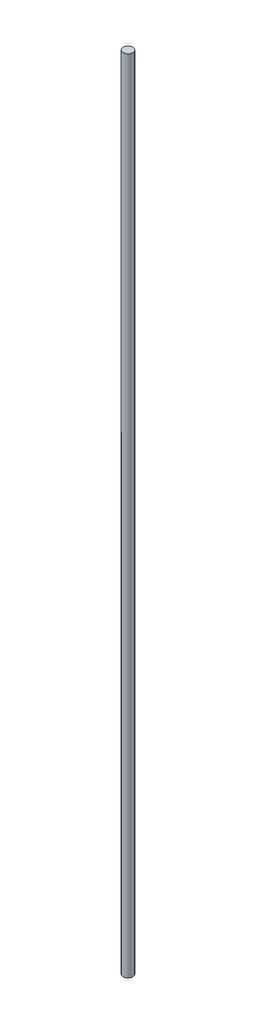
ISO-10303-21;
HEADER;
FILE_DESCRIPTION(('STEP AP214'),'2;1');
FILE_NAME('part.step','',(''),(''),'','','');
FILE_SCHEMA(('AUTOMOTIVE_DESIGN { 1 0 10303 214 1 1 1 1 }'));
ENDSEC;
DATA;
#1=APPLICATION_CONTEXT('core data for automotive mechanical design processes');
#2=APPLICATION_PROTOCOL_DEFINITION('international standard','automotive_design',2000,#1);
#3=PRODUCT_CONTEXT('',#1,'mechanical');
#4=PRODUCT('Part','Part','',(#3));
#5=PRODUCT_RELATED_PRODUCT_CATEGORY('part','',(#4));
#6=PRODUCT_DEFINITION_FORMATION('','',#4);
#7=PRODUCT_DEFINITION_CONTEXT('part definition',#1,'design');
#8=PRODUCT_DEFINITION('design','',#6,#7);
#9=PRODUCT_DEFINITION_SHAPE('','',#8);
#10=(LENGTH_UNIT() NAMED_UNIT(*) SI_UNIT(.MILLI.,.METRE.));
#11=(NAMED_UNIT(*) PLANE_ANGLE_UNIT() SI_UNIT($,.RADIAN.));
#12=(NAMED_UNIT(*) SI_UNIT($,.STERADIAN.) SOLID_ANGLE_UNIT());
#13=UNCERTAINTY_MEASURE_WITH_UNIT(LENGTH_MEASURE(1.E-05),#10,'distance_accuracy_value','');
#14=(GEOMETRIC_REPRESENTATION_CONTEXT(3) GLOBAL_UNCERTAINTY_ASSIGNED_CONTEXT((#13)) GLOBAL_UNIT_ASSIGNED_CONTEXT((#10,
#11,#12)) REPRESENTATION_CONTEXT('',''));
#15=CARTESIAN_POINT('',(0.,0.,0.));
#16=DIRECTION('',(0.,0.,1.));
#17=DIRECTION('',(1.,0.,0.));
#18=AXIS2_PLACEMENT_3D('',#15,#16,#17);
#19=CARTESIAN_POINT('',(0.,100.,0.));
#20=DIRECTION('',(0.,-1.,0.));
#21=DIRECTION('',(0.,0.,-1.));
#22=AXIS2_PLACEMENT_3D('',#19,#20,#21);
#23=CYLINDRICAL_SURFACE('',#22,0.6);
#24=CARTESIAN_POINT('',(0.,100.,0.));
#25=DIRECTION('',(0.,1.,0.));
#26=DIRECTION('',(0.,0.,1.));
#27=AXIS2_PLACEMENT_3D('',#24,#25,#26);
#28=CIRCLE('',#27,0.6);
#29=CARTESIAN_POINT('',(0.,100.,0.6));
#30=VERTEX_POINT('',#29);
#31=EDGE_CURVE('E10',#30,#30,#28,.T.);
#32=ORIENTED_EDGE('',*,*,#31,.F.);
#33=EDGE_LOOP('',(#32));
#34=FACE_BOUND('',#33,.T.);
#35=CARTESIAN_POINT('',(0.,0.,0.));
#36=DIRECTION('',(0.,1.,0.));
#37=DIRECTION('',(0.,0.,1.));
#38=AXIS2_PLACEMENT_3D('',#35,#36,#37);
#39=CIRCLE('',#38,0.6);
#40=CARTESIAN_POINT('',(0.,0.,0.6));
#41=VERTEX_POINT('',#40);
#42=EDGE_CURVE('E37',#41,#41,#39,.T.);
#43=ORIENTED_EDGE('',*,*,#42,.T.);
#44=EDGE_LOOP('',(#43));
#45=FACE_BOUND('',#44,.T.);
#46=ADVANCED_FACE('F34',(#34,#45),#23,.T.);
#47=CARTESIAN_POINT('',(0.,100.,0.));
#48=DIRECTION('',(0.,1.,0.));
#49=DIRECTION('',(0.,0.,1.));
#50=AXIS2_PLACEMENT_3D('',#47,#48,#49);
#51=PLANE('',#50);
#52=ORIENTED_EDGE('',*,*,#31,.T.);
#53=EDGE_LOOP('',(#52));
#54=FACE_BOUND('',#53,.T.);
#55=ADVANCED_FACE('F49',(#54),#51,.T.);
#56=CARTESIAN_POINT('',(0.,0.,0.));
#57=DIRECTION('',(0.,1.,0.));
#58=DIRECTION('',(0.,0.,1.));
#59=AXIS2_PLACEMENT_3D('',#56,#57,#58);
#60=PLANE('',#59);
#61=ORIENTED_EDGE('',*,*,#42,.F.);
#62=EDGE_LOOP('',(#61));
#63=FACE_BOUND('',#62,.T.);
#64=ADVANCED_FACE('F47',(#63),#60,.F.);
#65=CLOSED_SHELL('',(#46,#55,#64));
#66=MANIFOLD_SOLID_BREP('B2',#65);
#67=ADVANCED_BREP_SHAPE_REPRESENTATION('',(#18,#66),#14);
#68=SHAPE_DEFINITION_REPRESENTATION(#9,#67);
ENDSEC;
END-ISO-10303-21;
